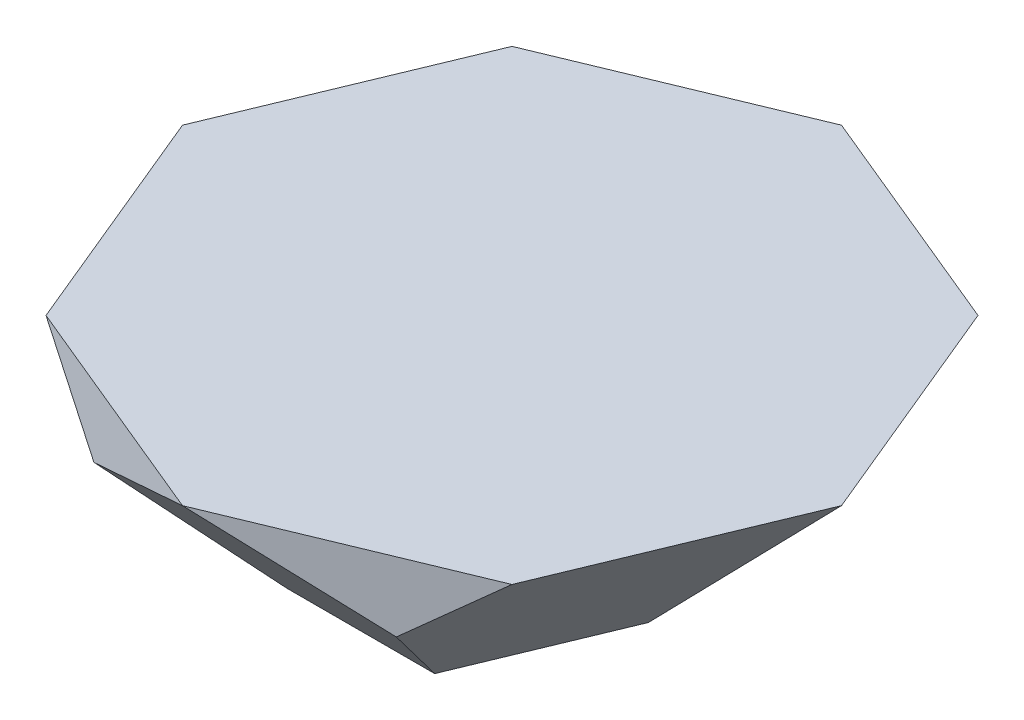
ISO-10303-21;
HEADER;
FILE_DESCRIPTION(('STEP AP214'),'2;1');
FILE_NAME('part.step','',(''),(''),'','','');
FILE_SCHEMA(('AUTOMOTIVE_DESIGN { 1 0 10303 214 1 1 1 1 }'));
ENDSEC;
DATA;
#1=APPLICATION_CONTEXT('core data for automotive mechanical design processes');
#2=APPLICATION_PROTOCOL_DEFINITION('international standard','automotive_design',2000,#1);
#3=PRODUCT_CONTEXT('',#1,'mechanical');
#4=PRODUCT('Part','Part','',(#3));
#5=PRODUCT_RELATED_PRODUCT_CATEGORY('part','',(#4));
#6=PRODUCT_DEFINITION_FORMATION('','',#4);
#7=PRODUCT_DEFINITION_CONTEXT('part definition',#1,'design');
#8=PRODUCT_DEFINITION('design','',#6,#7);
#9=PRODUCT_DEFINITION_SHAPE('','',#8);
#10=(LENGTH_UNIT() NAMED_UNIT(*) SI_UNIT(.MILLI.,.METRE.));
#11=(NAMED_UNIT(*) PLANE_ANGLE_UNIT() SI_UNIT($,.RADIAN.));
#12=(NAMED_UNIT(*) SI_UNIT($,.STERADIAN.) SOLID_ANGLE_UNIT());
#13=UNCERTAINTY_MEASURE_WITH_UNIT(LENGTH_MEASURE(1.E-05),#10,'distance_accuracy_value','');
#14=(GEOMETRIC_REPRESENTATION_CONTEXT(3) GLOBAL_UNCERTAINTY_ASSIGNED_CONTEXT((#13)) GLOBAL_UNIT_ASSIGNED_CONTEXT((#10,
#11,#12)) REPRESENTATION_CONTEXT('',''));
#15=CARTESIAN_POINT('',(0.,0.,0.));
#16=DIRECTION('',(0.,0.,1.));
#17=DIRECTION('',(1.,0.,0.));
#18=AXIS2_PLACEMENT_3D('',#15,#16,#17);
#19=CARTESIAN_POINT('',(35.3553390593277,30.,-35.3553390593273));
#20=DIRECTION('',(-0.382683432365088,0.,0.923879532511288));
#21=DIRECTION('',(0.923879532511288,0.,0.382683432365088));
#22=AXIS2_PLACEMENT_3D('',#19,#20,#21);
#23=PLANE('',#22);
#24=DIRECTION('',(-0.727090484702955,-0.616956734723614,-0.30117073983639));
#25=VECTOR('',#24,1.);
#26=CARTESIAN_POINT('',(35.3553390593277,30.,-35.3553390593273));
#27=LINE('',#26,#25);
#28=CARTESIAN_POINT('',(35.3553390593277,30.,-35.3553390593273));
#29=VERTEX_POINT('',#28);
#30=CARTESIAN_POINT('',(22.9403288826963,19.4655145387246,-40.497804651488));
#31=VERTEX_POINT('',#30);
#32=EDGE_CURVE('E214',#29,#31,#27,.T.);
#33=ORIENTED_EDGE('',*,*,#32,.T.);
#34=DIRECTION('',(-0.850502203952786,0.390561231625648,-0.35228954770545));
#35=VECTOR('',#34,1.);
#36=CARTESIAN_POINT('',(29.9623036753019,16.2409360359315,-37.5892074577488));
#37=LINE('',#36,#35);
#38=CARTESIAN_POINT('',(0.,30.,-50.));
#39=VERTEX_POINT('',#38);
#40=EDGE_CURVE('E209',#31,#39,#37,.T.);
#41=ORIENTED_EDGE('',*,*,#40,.T.);
#42=DIRECTION('',(-0.923879532511288,0.,-0.382683432365088));
#43=VECTOR('',#42,1.);
#44=CARTESIAN_POINT('',(35.3553390593277,30.,-35.3553390593273));
#45=LINE('',#44,#43);
#46=EDGE_CURVE('E174',#29,#39,#45,.T.);
#47=ORIENTED_EDGE('',*,*,#46,.F.);
#48=EDGE_LOOP('',(#33,#41,#47));
#49=FACE_BOUND('',#48,.T.);
#50=ADVANCED_FACE('F55',(#49),#23,.F.);
#51=CARTESIAN_POINT('',(0.,30.,-50.));
#52=DIRECTION('',(0.382683432365083,0.,0.92387953251129));
#53=DIRECTION('',(0.92387953251129,0.,-0.382683432365083));
#54=AXIS2_PLACEMENT_3D('',#51,#52,#53);
#55=PLANE('',#54);
#56=DIRECTION('',(-0.92387953251129,0.,0.382683432365083));
#57=VECTOR('',#56,1.);
#58=CARTESIAN_POINT('',(0.,30.,-50.));
#59=LINE('',#58,#57);
#60=CARTESIAN_POINT('',(-35.3553390593273,30.,-35.3553390593277));
#61=VERTEX_POINT('',#60);
#62=EDGE_CURVE('E170',#39,#61,#59,.T.);
#63=ORIENTED_EDGE('',*,*,#62,.F.);
#64=DIRECTION('',(-0.850502203952789,-0.390561231625644,0.352289547705446));
#65=VECTOR('',#64,1.);
#66=CARTESIAN_POINT('',(0.,30.,-50.));
#67=LINE('',#66,#65);
#68=CARTESIAN_POINT('',(-22.9402708350943,19.4655411949084,-40.4978286955922));
#69=VERTEX_POINT('',#68);
#70=EDGE_CURVE('E213',#39,#69,#67,.T.);
#71=ORIENTED_EDGE('',*,*,#70,.T.);
#72=DIRECTION('',(-0.727092478994468,0.616953981171722,0.301171565898977));
#73=VECTOR('',#72,1.);
#74=CARTESIAN_POINT('',(-13.4573810141137,11.4191003402902,-44.425770269932));
#75=LINE('',#74,#73);
#76=EDGE_CURVE('E58',#69,#61,#75,.T.);
#77=ORIENTED_EDGE('',*,*,#76,.T.);
#78=EDGE_LOOP('',(#63,#71,#77));
#79=FACE_BOUND('',#78,.T.);
#80=ADVANCED_FACE('F259',(#79),#55,.F.);
#81=CARTESIAN_POINT('',(-7.32233047033562,0.,-67.6776695296637));
#82=DIRECTION('',(-0.686033806316025,0.669782165822482,0.284164506822529));
#83=DIRECTION('',(-0.698580782452976,-0.71553119455925,0.));
#84=AXIS2_PLACEMENT_3D('',#81,#82,#83);
#85=PLANE('',#84);
#86=DIRECTION('',(0.382683432365083,0.,0.92387953251129));
#87=VECTOR('',#86,1.);
#88=CARTESIAN_POINT('',(17.6776695296639,0.,-7.32233047033626));
#89=LINE('',#88,#87);
#90=CARTESIAN_POINT('',(11.2087245270994,0.,-22.9397452297734));
#91=VERTEX_POINT('',#90);
#92=CARTESIAN_POINT('',(20.7106781186547,0.,-3.23823782103071E-13));
#93=VERTEX_POINT('',#92);
#94=EDGE_CURVE('E199',#91,#93,#89,.T.);
#95=ORIENTED_EDGE('',*,*,#94,.F.);
#96=DIRECTION('',(0.408486045399429,0.67777524834404,-0.611359029904777));
#97=VECTOR('',#96,1.);
#98=CARTESIAN_POINT('',(19.2890918196745,13.40724612289,-35.0331950915247));
#99=LINE('',#98,#97);
#100=EDGE_CURVE('E205',#91,#31,#99,.T.);
#101=ORIENTED_EDGE('',*,*,#100,.T.);
#102=ORIENTED_EDGE('',*,*,#32,.F.);
#103=DIRECTION('',(-0.382683432365083,0.,-0.923879532511289));
#104=VECTOR('',#103,1.);
#105=CARTESIAN_POINT('',(50.,30.,0.));
#106=LINE('',#105,#104);
#107=CARTESIAN_POINT('',(50.,30.,0.));
#108=VERTEX_POINT('',#107);
#109=EDGE_CURVE('E138',#108,#29,#106,.T.);
#110=ORIENTED_EDGE('',*,*,#109,.F.);
#111=DIRECTION('',(-0.698580782452978,-0.715531194559249,0.));
#112=VECTOR('',#111,1.);
#113=CARTESIAN_POINT('',(7.03014635932693,-14.0124771219519,-4.57966997657877E-13));
#114=LINE('',#113,#112);
#115=EDGE_CURVE('E145',#108,#93,#114,.T.);
#116=ORIENTED_EDGE('',*,*,#115,.T.);
#117=EDGE_LOOP('',(#95,#101,#102,#110,#116));
#118=FACE_BOUND('',#117,.T.);
#119=ADVANCED_FACE('F224',(#118),#85,.F.);
#120=CARTESIAN_POINT('',(7.32251062009155,0.,-67.6775949091917));
#121=DIRECTION('',(0.686031588600669,0.669784827071319,0.284163588214755));
#122=DIRECTION('',(-0.698583359754058,0.715528678303485,0.));
#123=AXIS2_PLACEMENT_3D('',#120,#121,#122);
#124=PLANE('',#123);
#125=ORIENTED_EDGE('',*,*,#76,.F.);
#126=DIRECTION('',(0.408490018080576,-0.677773928168657,0.611357839095369));
#127=VECTOR('',#126,1.);
#128=CARTESIAN_POINT('',(-19.2888940338226,13.4071116414753,-35.0330737881465));
#129=LINE('',#128,#127);
#130=CARTESIAN_POINT('',(-11.2085134685322,0.,-22.9397452297734));
#131=VERTEX_POINT('',#130);
#132=EDGE_CURVE('E92',#69,#131,#129,.T.);
#133=ORIENTED_EDGE('',*,*,#132,.T.);
#134=DIRECTION('',(-0.382683432365088,0.,0.923879532511287));
#135=VECTOR('',#134,1.);
#136=CARTESIAN_POINT('',(7.32251062009155,0.,-67.6775949091917));
#137=LINE('',#136,#135);
#138=CARTESIAN_POINT('',(-20.7105725893711,0.,0.000254770226838785));
#139=VERTEX_POINT('',#138);
#140=EDGE_CURVE('E185',#131,#139,#137,.T.);
#141=ORIENTED_EDGE('',*,*,#140,.T.);
#142=DIRECTION('',(0.698582071094021,-0.715529936417103,6.07652414181999E-06));
#143=VECTOR('',#142,1.);
#144=CARTESIAN_POINT('',(-58.6271828254306,38.8364815444974,-7.50424136719552E-05));
#145=LINE('',#144,#143);
#146=CARTESIAN_POINT('',(-50.,30.,0.));
#147=VERTEX_POINT('',#146);
#148=EDGE_CURVE('E186',#147,#139,#145,.T.);
#149=ORIENTED_EDGE('',*,*,#148,.F.);
#150=DIRECTION('',(-0.382683432365088,0.,0.923879532511287));
#151=VECTOR('',#150,1.);
#152=CARTESIAN_POINT('',(-35.3553390593273,30.,-35.3553390593277));
#153=LINE('',#152,#151);
#154=EDGE_CURVE('E166',#61,#147,#153,.T.);
#155=ORIENTED_EDGE('',*,*,#154,.F.);
#156=EDGE_LOOP('',(#125,#133,#141,#149,#155));
#157=FACE_BOUND('',#156,.T.);
#158=ADVANCED_FACE('F232',(#157),#124,.F.);
#159=CARTESIAN_POINT('',(-35.3553390593277,30.,35.3553390593273));
#160=DIRECTION('',(0.382683432365088,0.,-0.923879532511287));
#161=DIRECTION('',(-0.923879532511288,0.,-0.382683432365088));
#162=AXIS2_PLACEMENT_3D('',#159,#160,#161);
#163=PLANE('',#162);
#164=DIRECTION('',(0.72709048470296,-0.616956734723607,0.301170739836392));
#165=VECTOR('',#164,1.);
#166=CARTESIAN_POINT('',(-35.3553390593277,30.,35.3553390593273));
#167=LINE('',#166,#165);
#168=CARTESIAN_POINT('',(-35.3553390593277,30.,35.3553390593273));
#169=VERTEX_POINT('',#168);
#170=CARTESIAN_POINT('',(-22.9402530404549,19.465450184449,40.497836066373));
#171=VERTEX_POINT('',#170);
#172=EDGE_CURVE('E180',#169,#171,#167,.T.);
#173=ORIENTED_EDGE('',*,*,#172,.T.);
#174=DIRECTION('',(0.850500982502779,0.390564347853981,0.352289041764291));
#175=VECTOR('',#174,1.);
#176=CARTESIAN_POINT('',(-29.9622176145496,16.2408460147224,37.5892431052796));
#177=LINE('',#176,#175);
#178=CARTESIAN_POINT('',(0.,30.,50.));
#179=VERTEX_POINT('',#178);
#180=EDGE_CURVE('E184',#171,#179,#177,.T.);
#181=ORIENTED_EDGE('',*,*,#180,.T.);
#182=DIRECTION('',(0.923879532511288,0.,0.382683432365088));
#183=VECTOR('',#182,1.);
#184=CARTESIAN_POINT('',(-35.3553390593277,30.,35.3553390593273));
#185=LINE('',#184,#183);
#186=EDGE_CURVE('E156',#169,#179,#185,.T.);
#187=ORIENTED_EDGE('',*,*,#186,.F.);
#188=EDGE_LOOP('',(#173,#181,#187));
#189=FACE_BOUND('',#188,.T.);
#190=ADVANCED_FACE('F268',(#189),#163,.F.);
#191=CARTESIAN_POINT('',(0.,30.,50.));
#192=DIRECTION('',(-0.382683432365083,0.,-0.92387953251129));
#193=DIRECTION('',(-0.92387953251129,0.,0.382683432365083));
#194=AXIS2_PLACEMENT_3D('',#191,#192,#193);
#195=PLANE('',#194);
#196=DIRECTION('',(0.92387953251129,0.,-0.382683432365083));
#197=VECTOR('',#196,1.);
#198=CARTESIAN_POINT('',(0.,30.,50.));
#199=LINE('',#198,#197);
#200=CARTESIAN_POINT('',(35.3553390593273,30.,35.3553390593277));
#201=VERTEX_POINT('',#200);
#202=EDGE_CURVE('E133',#179,#201,#199,.T.);
#203=ORIENTED_EDGE('',*,*,#202,.F.);
#204=DIRECTION('',(0.850500982502782,-0.390564347853977,-0.352289041764288));
#205=VECTOR('',#204,1.);
#206=CARTESIAN_POINT('',(0.,30.,50.));
#207=LINE('',#206,#205);
#208=CARTESIAN_POINT('',(22.9402530404548,19.4654501844492,40.4978360663731));
#209=VERTEX_POINT('',#208);
#210=EDGE_CURVE('E134',#179,#209,#207,.T.);
#211=ORIENTED_EDGE('',*,*,#210,.T.);
#212=DIRECTION('',(0.727090484702959,0.616956734723611,-0.301170739836387));
#213=VECTOR('',#212,1.);
#214=CARTESIAN_POINT('',(13.4575011387283,11.4190683756246,44.4257205126874));
#215=LINE('',#214,#213);
#216=EDGE_CURVE('E129',#209,#201,#215,.T.);
#217=ORIENTED_EDGE('',*,*,#216,.T.);
#218=EDGE_LOOP('',(#203,#211,#217));
#219=FACE_BOUND('',#218,.T.);
#220=ADVANCED_FACE('F131',(#219),#195,.F.);
#221=CARTESIAN_POINT('',(0.,30.,0.));
#222=DIRECTION('',(0.,1.,0.));
#223=DIRECTION('',(0.,0.,1.));
#224=AXIS2_PLACEMENT_3D('',#221,#222,#223);
#225=PLANE('',#224);
#226=ORIENTED_EDGE('',*,*,#109,.T.);
#227=ORIENTED_EDGE('',*,*,#46,.T.);
#228=ORIENTED_EDGE('',*,*,#62,.T.);
#229=ORIENTED_EDGE('',*,*,#154,.T.);
#230=DIRECTION('',(0.382683432365084,0.,0.923879532511289));
#231=VECTOR('',#230,1.);
#232=CARTESIAN_POINT('',(-50.,30.,0.));
#233=LINE('',#232,#231);
#234=EDGE_CURVE('E160',#147,#169,#233,.T.);
#235=ORIENTED_EDGE('',*,*,#234,.T.);
#236=ORIENTED_EDGE('',*,*,#186,.T.);
#237=ORIENTED_EDGE('',*,*,#202,.T.);
#238=DIRECTION('',(0.382683432365088,0.,-0.923879532511287));
#239=VECTOR('',#238,1.);
#240=CARTESIAN_POINT('',(35.3553390593273,30.,35.3553390593277));
#241=LINE('',#240,#239);
#242=EDGE_CURVE('E141',#201,#108,#241,.T.);
#243=ORIENTED_EDGE('',*,*,#242,.T.);
#244=EDGE_LOOP('',(#226,#227,#228,#229,#235,#236,#237,#243));
#245=FACE_BOUND('',#244,.T.);
#246=ADVANCED_FACE('F153',(#245),#225,.T.);
#247=CARTESIAN_POINT('',(0.,0.,0.));
#248=DIRECTION('',(0.,1.,0.));
#249=DIRECTION('',(0.,0.,1.));
#250=AXIS2_PLACEMENT_3D('',#247,#248,#249);
#251=PLANE('',#250);
#252=DIRECTION('',(-0.382683432365088,0.,0.923879532511287));
#253=VECTOR('',#252,1.);
#254=CARTESIAN_POINT('',(42.6776695296635,0.,-53.0330085889911));
#255=LINE('',#254,#253);
#256=CARTESIAN_POINT('',(11.2086189978159,0.,22.94));
#257=VERTEX_POINT('',#256);
#258=EDGE_CURVE('E150',#93,#257,#255,.T.);
#259=ORIENTED_EDGE('',*,*,#258,.T.);
#260=DIRECTION('',(1.,0.,0.));
#261=VECTOR('',#260,1.);
#262=CARTESIAN_POINT('',(-50.,0.,22.94));
#263=LINE('',#262,#261);
#264=CARTESIAN_POINT('',(-11.2086189978157,0.,22.94));
#265=VERTEX_POINT('',#264);
#266=EDGE_CURVE('E12',#265,#257,#263,.T.);
#267=ORIENTED_EDGE('',*,*,#266,.F.);
#268=DIRECTION('',(-0.382683432365083,0.,-0.923879532511289));
#269=VECTOR('',#268,1.);
#270=CARTESIAN_POINT('',(-17.6776695296634,0.,7.32233047033606));
#271=LINE('',#270,#269);
#272=EDGE_CURVE('E193',#265,#139,#271,.T.);
#273=ORIENTED_EDGE('',*,*,#272,.T.);
#274=ORIENTED_EDGE('',*,*,#140,.F.);
#275=DIRECTION('',(1.,0.,0.));
#276=VECTOR('',#275,1.);
#277=CARTESIAN_POINT('',(-50.,0.,-22.9397452297735));
#278=LINE('',#277,#276);
#279=EDGE_CURVE('E99',#131,#91,#278,.T.);
#280=ORIENTED_EDGE('',*,*,#279,.T.);
#281=ORIENTED_EDGE('',*,*,#94,.T.);
#282=EDGE_LOOP('',(#259,#267,#273,#274,#280,#281));
#283=FACE_BOUND('',#282,.T.);
#284=ADVANCED_FACE('F228',(#283),#251,.F.);
#285=CARTESIAN_POINT('',(-67.6776695296634,30.,-42.677669529664));
#286=DIRECTION('',(0.68603380631602,0.669782165822488,-0.284164506822527));
#287=DIRECTION('',(-0.698580782452982,0.715531194559245,0.));
#288=AXIS2_PLACEMENT_3D('',#285,#286,#287);
#289=PLANE('',#288);
#290=ORIENTED_EDGE('',*,*,#272,.F.);
#291=DIRECTION('',(-0.408489469177835,0.677776973288914,0.611354829906601));
#292=VECTOR('',#291,1.);
#293=CARTESIAN_POINT('',(-12.5503608614095,2.22625503925946,24.948082045412));
#294=LINE('',#293,#292);
#295=EDGE_CURVE('E73',#265,#171,#294,.T.);
#296=ORIENTED_EDGE('',*,*,#295,.T.);
#297=ORIENTED_EDGE('',*,*,#172,.F.);
#298=ORIENTED_EDGE('',*,*,#234,.F.);
#299=ORIENTED_EDGE('',*,*,#148,.T.);
#300=EDGE_LOOP('',(#290,#296,#297,#298,#299));
#301=FACE_BOUND('',#300,.T.);
#302=ADVANCED_FACE('F236',(#301),#289,.F.);
#303=CARTESIAN_POINT('',(42.6776695296635,0.,-53.0330085889911));
#304=DIRECTION('',(-0.686033806316022,0.669782165822484,-0.284164506822532));
#305=DIRECTION('',(-0.698580782452979,-0.715531194559248,0.));
#306=AXIS2_PLACEMENT_3D('',#303,#304,#305);
#307=PLANE('',#306);
#308=ORIENTED_EDGE('',*,*,#216,.F.);
#309=DIRECTION('',(-0.408489469177827,-0.677776973288917,-0.611354829906604));
#310=VECTOR('',#309,1.);
#311=CARTESIAN_POINT('',(-2.51323261748978,-22.7676739732372,2.40355807613996));
#312=LINE('',#311,#310);
#313=EDGE_CURVE('E65',#209,#257,#312,.T.);
#314=ORIENTED_EDGE('',*,*,#313,.T.);
#315=ORIENTED_EDGE('',*,*,#258,.F.);
#316=ORIENTED_EDGE('',*,*,#115,.F.);
#317=ORIENTED_EDGE('',*,*,#242,.F.);
#318=EDGE_LOOP('',(#308,#314,#315,#316,#317));
#319=FACE_BOUND('',#318,.T.);
#320=ADVANCED_FACE('F142',(#319),#307,.F.);
#321=CARTESIAN_POINT('',(-50.,30.,-50.));
#322=DIRECTION('',(0.,0.669788304121589,0.742552104341457));
#323=DIRECTION('',(0.,-0.742552104341457,0.669788304121589));
#324=AXIS2_PLACEMENT_3D('',#321,#322,#323);
#325=PLANE('',#324);
#326=ORIENTED_EDGE('',*,*,#279,.F.);
#327=ORIENTED_EDGE('',*,*,#132,.F.);
#328=ORIENTED_EDGE('',*,*,#70,.F.);
#329=ORIENTED_EDGE('',*,*,#40,.F.);
#330=ORIENTED_EDGE('',*,*,#100,.F.);
#331=EDGE_LOOP('',(#326,#327,#328,#329,#330));
#332=FACE_BOUND('',#331,.T.);
#333=ADVANCED_FACE('F225',(#332),#325,.F.);
#334=CARTESIAN_POINT('',(-50.,0.,22.94));
#335=DIRECTION('',(0.,0.66978482707132,-0.742555240655564));
#336=DIRECTION('',(0.,0.742555240655564,0.66978482707132));
#337=AXIS2_PLACEMENT_3D('',#334,#335,#336);
#338=PLANE('',#337);
#339=ORIENTED_EDGE('',*,*,#266,.T.);
#340=ORIENTED_EDGE('',*,*,#313,.F.);
#341=ORIENTED_EDGE('',*,*,#210,.F.);
#342=ORIENTED_EDGE('',*,*,#180,.F.);
#343=ORIENTED_EDGE('',*,*,#295,.F.);
#344=EDGE_LOOP('',(#339,#340,#341,#342,#343));
#345=FACE_BOUND('',#344,.T.);
#346=ADVANCED_FACE('F250',(#345),#338,.F.);
#347=CLOSED_SHELL('',(#50,#80,#119,#158,#190,#220,#246,#284,#302,#320,#333,#346));
#348=MANIFOLD_SOLID_BREP('B2',#347);
#349=CARTESIAN_POINT('',(7.32251062009155,0.,-67.6775949091917));
#350=DIRECTION('',(0.686031588600669,0.669784827071319,0.284163588214755));
#351=DIRECTION('',(-0.698583359754058,0.715528678303485,0.));
#352=AXIS2_PLACEMENT_3D('',#349,#350,#351);
#353=PLANE('',#352);
#354=DIRECTION('',(-1.37387005190505E-06,0.390565540394542,-0.920575123851623));
#355=VECTOR('',#354,1.);
#356=CARTESIAN_POINT('',(8.31711046015218E-05,6.35601182003261,-64.9810627380159));
#357=LINE('',#356,#355);
#358=CARTESIAN_POINT('',(0.000105529283680062,0.,-49.9997452297735));
#359=VERTEX_POINT('',#358);
#360=CARTESIAN_POINT('',(0.000105528968675127,8.95442986833736E-05,-49.99995628847));
#361=VERTEX_POINT('',#360);
#362=EDGE_CURVE('E359',#359,#361,#357,.T.);
#363=ORIENTED_EDGE('',*,*,#362,.F.);
#364=DIRECTION('',(-0.698582071094023,0.715529936417101,-6.07652413357873E-06));
#365=VECTOR('',#364,1.);
#366=CARTESIAN_POINT('',(3.57348799426113,-3.66007407541264,-49.9997141471767));
#367=LINE('',#366,#365);
#368=CARTESIAN_POINT('',(-0.00061505460419338,0.000738065525584652,-49.9997452360413));
#369=VERTEX_POINT('',#368);
#370=EDGE_CURVE('E53',#359,#369,#367,.T.);
#371=ORIENTED_EDGE('',*,*,#370,.T.);
#372=DIRECTION('',(-0.727092478994468,0.616953981171722,0.301171565898977));
#373=VECTOR('',#372,1.);
#374=CARTESIAN_POINT('',(-13.4573810141137,11.4191003402902,-44.425770269932));
#375=LINE('',#374,#373);
#376=CARTESIAN_POINT('',(0.,0.000216178148594332,-50.));
#377=VERTEX_POINT('',#376);
#378=EDGE_CURVE('E400',#377,#369,#375,.T.);
#379=ORIENTED_EDGE('',*,*,#378,.F.);
#380=DIRECTION('',(-0.618800492917804,0.742555240655564,-0.256315556569709));
#381=VECTOR('',#380,1.);
#382=CARTESIAN_POINT('',(2.07611213915779,-2.4911004364376,-49.1400461949534));
#383=LINE('',#382,#381);
#384=EDGE_CURVE('E394',#361,#377,#383,.T.);
#385=ORIENTED_EDGE('',*,*,#384,.F.);
#386=EDGE_LOOP('',(#363,#371,#379,#385));
#387=FACE_BOUND('',#386,.T.);
#388=ADVANCED_FACE('F351',(#387),#353,.F.);
#389=CARTESIAN_POINT('',(-7.32233047033562,0.,-67.6776695296637));
#390=DIRECTION('',(-0.686033806316025,0.669782165822482,0.284164506822529));
#391=DIRECTION('',(-0.698580782452976,-0.71553119455925,0.));
#392=AXIS2_PLACEMENT_3D('',#389,#390,#391);
#393=PLANE('',#392);
#394=DIRECTION('',(-0.727090484702955,-0.616956734723614,-0.30117073983639));
#395=VECTOR('',#394,1.);
#396=CARTESIAN_POINT('',(35.3553390593277,30.,-35.3553390593273));
#397=LINE('',#396,#395);
#398=CARTESIAN_POINT('',(0.000615059036240557,0.000521894897881131,-49.9997452342055));
#399=VERTEX_POINT('',#398);
#400=EDGE_CURVE('E373',#399,#361,#397,.T.);
#401=ORIENTED_EDGE('',*,*,#400,.F.);
#402=DIRECTION('',(-0.698579493779346,-0.715532452677073,6.07654550251617E-06));
#403=VECTOR('',#402,1.);
#404=CARTESIAN_POINT('',(-3.57326565186972,-3.66008889230846,-49.9997141470509));
#405=LINE('',#404,#403);
#406=EDGE_CURVE('E386',#399,#359,#405,.T.);
#407=ORIENTED_EDGE('',*,*,#406,.T.);
#408=ORIENTED_EDGE('',*,*,#362,.T.);
#409=EDGE_LOOP('',(#401,#407,#408));
#410=FACE_BOUND('',#409,.T.);
#411=ADVANCED_FACE('F392',(#410),#393,.F.);
#412=CARTESIAN_POINT('',(0.,30.,-50.));
#413=DIRECTION('',(0.382683432365083,0.,0.92387953251129));
#414=DIRECTION('',(0.92387953251129,0.,-0.382683432365083));
#415=AXIS2_PLACEMENT_3D('',#412,#413,#414);
#416=PLANE('',#415);
#417=ORIENTED_EDGE('',*,*,#378,.T.);
#418=DIRECTION('',(2.05023245361599E-05,0.999999999753767,-8.49234088305193E-06));
#419=VECTOR('',#418,1.);
#420=CARTESIAN_POINT('',(0.,30.,-50.));
#421=LINE('',#420,#419);
#422=CARTESIAN_POINT('',(0.,30.,-50.));
#423=VERTEX_POINT('',#422);
#424=EDGE_CURVE('E366',#369,#423,#421,.T.);
#425=ORIENTED_EDGE('',*,*,#424,.T.);
#426=DIRECTION('',(0.,-1.,0.));
#427=VECTOR('',#426,1.);
#428=CARTESIAN_POINT('',(0.,30.,-50.));
#429=LINE('',#428,#427);
#430=EDGE_CURVE('E395',#423,#377,#429,.T.);
#431=ORIENTED_EDGE('',*,*,#430,.T.);
#432=EDGE_LOOP('',(#417,#425,#431));
#433=FACE_BOUND('',#432,.T.);
#434=ADVANCED_FACE('F407',(#433),#416,.F.);
#435=CARTESIAN_POINT('',(35.3553390593277,30.,-35.3553390593273));
#436=DIRECTION('',(-0.382683432365088,0.,0.923879532511288));
#437=DIRECTION('',(0.923879532511288,0.,0.382683432365088));
#438=AXIS2_PLACEMENT_3D('',#435,#436,#437);
#439=PLANE('',#438);
#440=ORIENTED_EDGE('',*,*,#430,.F.);
#441=DIRECTION('',(2.05023245361596E-05,-0.999999999753767,8.49234088305193E-06));
#442=VECTOR('',#441,1.);
#443=CARTESIAN_POINT('',(1.74112599338194E-08,29.9991507659119,-49.999999992788));
#444=LINE('',#443,#442);
#445=EDGE_CURVE('E403',#423,#399,#444,.T.);
#446=ORIENTED_EDGE('',*,*,#445,.T.);
#447=ORIENTED_EDGE('',*,*,#400,.T.);
#448=ORIENTED_EDGE('',*,*,#384,.T.);
#449=EDGE_LOOP('',(#440,#446,#447,#448));
#450=FACE_BOUND('',#449,.T.);
#451=ADVANCED_FACE('F353',(#450),#439,.F.);
#452=CARTESIAN_POINT('',(-50.,0.,-49.9997452297734));
#453=DIRECTION('',(0.,-8.49234088483679E-06,-0.99999999996394));
#454=DIRECTION('',(0.,0.99999999996394,-8.49234088483679E-06));
#455=AXIS2_PLACEMENT_3D('',#452,#453,#454);
#456=PLANE('',#455);
#457=ORIENTED_EDGE('',*,*,#424,.F.);
#458=ORIENTED_EDGE('',*,*,#370,.F.);
#459=ORIENTED_EDGE('',*,*,#406,.F.);
#460=ORIENTED_EDGE('',*,*,#445,.F.);
#461=EDGE_LOOP('',(#457,#458,#459,#460));
#462=FACE_BOUND('',#461,.T.);
#463=ADVANCED_FACE('F385',(#462),#456,.F.);
#464=CLOSED_SHELL('',(#388,#411,#434,#451,#463));
#465=MANIFOLD_SOLID_BREP('B6',#464);
#466=ADVANCED_BREP_SHAPE_REPRESENTATION('',(#18,#348,#465),#14);
#467=SHAPE_DEFINITION_REPRESENTATION(#9,#466);
ENDSEC;
END-ISO-10303-21;
